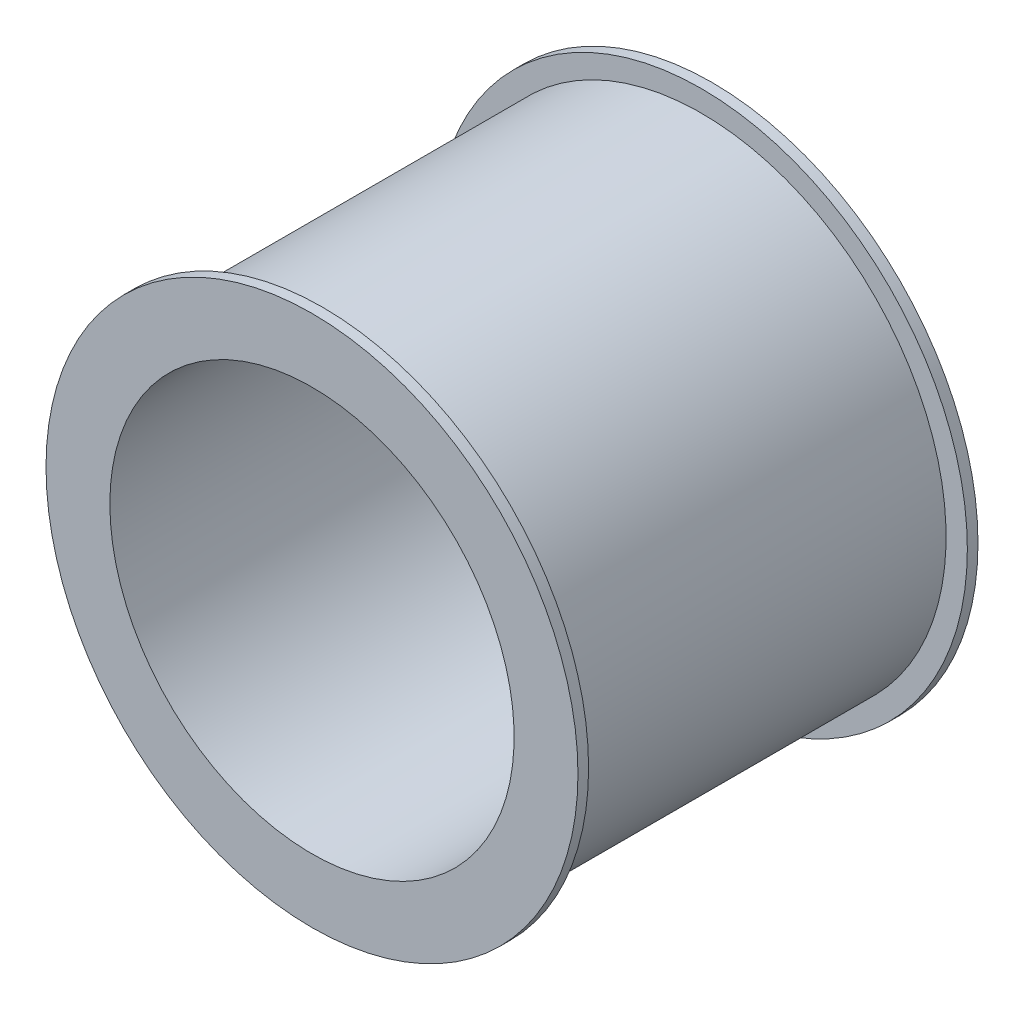
ISO-10303-21;
HEADER;
FILE_DESCRIPTION(('STEP AP214'),'2;1');
FILE_NAME('part.step','',(''),(''),'','','');
FILE_SCHEMA(('AUTOMOTIVE_DESIGN { 1 0 10303 214 1 1 1 1 }'));
ENDSEC;
DATA;
#1=APPLICATION_CONTEXT('core data for automotive mechanical design processes');
#2=APPLICATION_PROTOCOL_DEFINITION('international standard','automotive_design',2000,#1);
#3=PRODUCT_CONTEXT('',#1,'mechanical');
#4=PRODUCT('Part','Part','',(#3));
#5=PRODUCT_RELATED_PRODUCT_CATEGORY('part','',(#4));
#6=PRODUCT_DEFINITION_FORMATION('','',#4);
#7=PRODUCT_DEFINITION_CONTEXT('part definition',#1,'design');
#8=PRODUCT_DEFINITION('design','',#6,#7);
#9=PRODUCT_DEFINITION_SHAPE('','',#8);
#10=(LENGTH_UNIT() NAMED_UNIT(*) SI_UNIT(.MILLI.,.METRE.));
#11=(NAMED_UNIT(*) PLANE_ANGLE_UNIT() SI_UNIT($,.RADIAN.));
#12=(NAMED_UNIT(*) SI_UNIT($,.STERADIAN.) SOLID_ANGLE_UNIT());
#13=UNCERTAINTY_MEASURE_WITH_UNIT(LENGTH_MEASURE(1.E-05),#10,'distance_accuracy_value','');
#14=(GEOMETRIC_REPRESENTATION_CONTEXT(3) GLOBAL_UNCERTAINTY_ASSIGNED_CONTEXT((#13)) GLOBAL_UNIT_ASSIGNED_CONTEXT((#10,
#11,#12)) REPRESENTATION_CONTEXT('',''));
#15=CARTESIAN_POINT('',(0.,0.,0.));
#16=DIRECTION('',(0.,0.,1.));
#17=DIRECTION('',(1.,0.,0.));
#18=AXIS2_PLACEMENT_3D('',#15,#16,#17);
#19=CARTESIAN_POINT('',(0.,0.,18.8));
#20=DIRECTION('',(0.,0.,-1.));
#21=DIRECTION('',(-1.,0.,0.));
#22=AXIS2_PLACEMENT_3D('',#19,#20,#21);
#23=CYLINDRICAL_SURFACE('',#22,11.5);
#24=CARTESIAN_POINT('',(0.,0.,18.3));
#25=DIRECTION('',(0.,0.,1.));
#26=DIRECTION('',(1.,0.,0.));
#27=AXIS2_PLACEMENT_3D('',#24,#25,#26);
#28=CIRCLE('',#27,11.5);
#29=CARTESIAN_POINT('',(-11.5,0.,18.3));
#30=VERTEX_POINT('',#29);
#31=EDGE_CURVE('E60',#30,#30,#28,.T.);
#32=CARTESIAN_POINT('',(0.,0.,0.5));
#33=DIRECTION('',(0.,0.,-1.));
#34=DIRECTION('',(-1.,0.,0.));
#35=AXIS2_PLACEMENT_3D('',#32,#33,#34);
#36=CIRCLE('',#35,11.5);
#37=CARTESIAN_POINT('',(-11.5,0.,0.500000000000004));
#38=VERTEX_POINT('',#37);
#39=EDGE_CURVE('E11',#38,#38,#36,.T.);
#40=CARTESIAN_POINT('',(-11.5,0.,18.3));
#41=CARTESIAN_POINT('',(-11.5,0.,18.1145833333333));
#42=CARTESIAN_POINT('',(-11.5,0.,17.9291666666667));
#43=CARTESIAN_POINT('',(-11.5,0.,17.5583333333333));
#44=CARTESIAN_POINT('',(-11.5,0.,17.3729166666667));
#45=CARTESIAN_POINT('',(-11.5,0.,17.0020833333333));
#46=CARTESIAN_POINT('',(-11.5,0.,16.8166666666667));
#47=CARTESIAN_POINT('',(-11.5,0.,16.4458333333333));
#48=CARTESIAN_POINT('',(-11.5,0.,16.2604166666667));
#49=CARTESIAN_POINT('',(-11.5,0.,15.8895833333333));
#50=CARTESIAN_POINT('',(-11.5,0.,15.7041666666667));
#51=CARTESIAN_POINT('',(-11.5,0.,15.3333333333333));
#52=CARTESIAN_POINT('',(-11.5,0.,15.1479166666667));
#53=CARTESIAN_POINT('',(-11.5,0.,14.7770833333333));
#54=CARTESIAN_POINT('',(-11.5,0.,14.5916666666667));
#55=CARTESIAN_POINT('',(-11.5,0.,14.2208333333333));
#56=CARTESIAN_POINT('',(-11.5,0.,14.0354166666667));
#57=CARTESIAN_POINT('',(-11.5,0.,13.6645833333333));
#58=CARTESIAN_POINT('',(-11.5,0.,13.4791666666667));
#59=CARTESIAN_POINT('',(-11.5,0.,13.1083333333333));
#60=CARTESIAN_POINT('',(-11.5,0.,12.9229166666667));
#61=CARTESIAN_POINT('',(-11.5,0.,12.5520833333333));
#62=CARTESIAN_POINT('',(-11.5,0.,12.3666666666667));
#63=CARTESIAN_POINT('',(-11.5,0.,11.9958333333333));
#64=CARTESIAN_POINT('',(-11.5,0.,11.8104166666667));
#65=CARTESIAN_POINT('',(-11.5,0.,11.4395833333333));
#66=CARTESIAN_POINT('',(-11.5,0.,11.2541666666667));
#67=CARTESIAN_POINT('',(-11.5,0.,10.8833333333333));
#68=CARTESIAN_POINT('',(-11.5,0.,10.6979166666667));
#69=CARTESIAN_POINT('',(-11.5,0.,10.3270833333333));
#70=CARTESIAN_POINT('',(-11.5,0.,10.1416666666667));
#71=CARTESIAN_POINT('',(-11.5,0.,9.77083333333333));
#72=CARTESIAN_POINT('',(-11.5,0.,9.58541666666667));
#73=CARTESIAN_POINT('',(-11.5,0.,9.21458333333333));
#74=CARTESIAN_POINT('',(-11.5,0.,9.02916666666667));
#75=CARTESIAN_POINT('',(-11.5,0.,8.65833333333333));
#76=CARTESIAN_POINT('',(-11.5,0.,8.47291666666667));
#77=CARTESIAN_POINT('',(-11.5,0.,8.10208333333333));
#78=CARTESIAN_POINT('',(-11.5,0.,7.91666666666667));
#79=CARTESIAN_POINT('',(-11.5,0.,7.54583333333333));
#80=CARTESIAN_POINT('',(-11.5,0.,7.36041666666667));
#81=CARTESIAN_POINT('',(-11.5,0.,6.98958333333333));
#82=CARTESIAN_POINT('',(-11.5,0.,6.80416666666667));
#83=CARTESIAN_POINT('',(-11.5,0.,6.43333333333334));
#84=CARTESIAN_POINT('',(-11.5,0.,6.24791666666667));
#85=CARTESIAN_POINT('',(-11.5,0.,5.87708333333334));
#86=CARTESIAN_POINT('',(-11.5,0.,5.69166666666667));
#87=CARTESIAN_POINT('',(-11.5,0.,5.32083333333334));
#88=CARTESIAN_POINT('',(-11.5,0.,5.13541666666667));
#89=CARTESIAN_POINT('',(-11.5,0.,4.76458333333334));
#90=CARTESIAN_POINT('',(-11.5,0.,4.57916666666667));
#91=CARTESIAN_POINT('',(-11.5,0.,4.20833333333334));
#92=CARTESIAN_POINT('',(-11.5,0.,4.02291666666667));
#93=CARTESIAN_POINT('',(-11.5,0.,3.65208333333334));
#94=CARTESIAN_POINT('',(-11.5,0.,3.46666666666667));
#95=CARTESIAN_POINT('',(-11.5,0.,3.09583333333334));
#96=CARTESIAN_POINT('',(-11.5,0.,2.91041666666667));
#97=CARTESIAN_POINT('',(-11.5,0.,2.53958333333334));
#98=CARTESIAN_POINT('',(-11.5,0.,2.35416666666667));
#99=CARTESIAN_POINT('',(-11.5,0.,1.98333333333334));
#100=CARTESIAN_POINT('',(-11.5,0.,1.79791666666667));
#101=CARTESIAN_POINT('',(-11.5,0.,1.42708333333334));
#102=CARTESIAN_POINT('',(-11.5,0.,1.24166666666667));
#103=CARTESIAN_POINT('',(-11.5,0.,0.870833333333338));
#104=CARTESIAN_POINT('',(-11.5,0.,0.685416666666671));
#105=CARTESIAN_POINT('',(-11.5,0.,0.500000000000004));
#106=B_SPLINE_CURVE_WITH_KNOTS('',3,(#40,#41,#42,#43,#44,#45,#46,#47,#48,#49,#50,#51,#52,#53,
#54,#55,#56,#57,#58,#59,#60,#61,#62,#63,#64,#65,#66,#67,#68,#69,#70,#71,#72,#73,#74,#75,#76,#77,
#78,#79,#80,#81,#82,#83,#84,#85,#86,#87,#88,#89,#90,#91,#92,#93,#94,#95,#96,#97,#98,#99,#100,
#101,#102,#103,#104,#105),.UNSPECIFIED.,.F.,.F.,(4,2,2,2,2,2,2,2,2,2,2,2,2,2,2,2,2,2,2,2,2,2,2,
2,2,2,2,2,2,2,2,2,4),(0.,0.556249999999998,1.1125,1.66875,2.225,2.78125,3.3375,3.89375,4.45,
5.00625,5.56249999999999,6.11875,6.67499999999999,7.23124999999999,7.78749999999999,
8.34374999999999,8.89999999999999,9.45624999999999,10.0125,10.56875,11.125,11.68125,12.2375,
12.79375,13.35,13.90625,14.4625,15.01875,15.575,16.13125,16.6875,17.24375,17.8),.UNSPECIFIED.);
#107=EDGE_CURVE('BSEAM57',#30,#38,#106,.T.);
#108=ORIENTED_EDGE('',*,*,#31,.F.);
#109=ORIENTED_EDGE('',*,*,#39,.F.);
#110=ORIENTED_EDGE('',*,*,#107,.T.);
#111=ORIENTED_EDGE('',*,*,#107,.F.);
#112=EDGE_LOOP('',(#108,#110,#109,#111));
#113=FACE_BOUND('',#112,.T.);
#114=ADVANCED_FACE('F57',(#113),#23,.T.);
#115=CARTESIAN_POINT('',(0.,0.,18.8));
#116=DIRECTION('',(0.,0.,1.));
#117=DIRECTION('',(1.,0.,0.));
#118=AXIS2_PLACEMENT_3D('',#115,#116,#117);
#119=PLANE('',#118);
#120=CARTESIAN_POINT('',(0.,0.,18.8));
#121=DIRECTION('',(0.,0.,1.));
#122=DIRECTION('',(1.,0.,0.));
#123=AXIS2_PLACEMENT_3D('',#120,#121,#122);
#124=CIRCLE('',#123,9.5);
#125=CARTESIAN_POINT('',(-9.5,0.,18.8));
#126=VERTEX_POINT('',#125);
#127=EDGE_CURVE('E68',#126,#126,#124,.T.);
#128=ORIENTED_EDGE('',*,*,#127,.F.);
#129=EDGE_LOOP('',(#128));
#130=FACE_BOUND('',#129,.T.);
#131=CARTESIAN_POINT('',(0.,0.,18.8));
#132=DIRECTION('',(0.,0.,1.));
#133=DIRECTION('',(1.,0.,0.));
#134=AXIS2_PLACEMENT_3D('',#131,#132,#133);
#135=CIRCLE('',#134,12.5);
#136=CARTESIAN_POINT('',(12.5,0.,18.8));
#137=VERTEX_POINT('',#136);
#138=EDGE_CURVE('E77',#137,#137,#135,.T.);
#139=ORIENTED_EDGE('',*,*,#138,.T.);
#140=EDGE_LOOP('',(#139));
#141=FACE_BOUND('',#140,.T.);
#142=ADVANCED_FACE('F95',(#130,#141),#119,.T.);
#143=CARTESIAN_POINT('',(0.,0.,0.));
#144=DIRECTION('',(0.,0.,1.));
#145=DIRECTION('',(1.,0.,0.));
#146=AXIS2_PLACEMENT_3D('',#143,#144,#145);
#147=PLANE('',#146);
#148=CARTESIAN_POINT('',(0.,0.,0.));
#149=DIRECTION('',(0.,0.,1.));
#150=DIRECTION('',(1.,0.,0.));
#151=AXIS2_PLACEMENT_3D('',#148,#149,#150);
#152=CIRCLE('',#151,9.5);
#153=CARTESIAN_POINT('',(-9.5,0.,0.));
#154=VERTEX_POINT('',#153);
#155=EDGE_CURVE('E76',#154,#154,#152,.T.);
#156=ORIENTED_EDGE('',*,*,#155,.T.);
#157=EDGE_LOOP('',(#156));
#158=FACE_BOUND('',#157,.T.);
#159=CARTESIAN_POINT('',(0.,0.,0.));
#160=DIRECTION('',(0.,0.,-1.));
#161=DIRECTION('',(-1.,0.,0.));
#162=AXIS2_PLACEMENT_3D('',#159,#160,#161);
#163=CIRCLE('',#162,12.5);
#164=CARTESIAN_POINT('',(-12.5,0.,0.));
#165=VERTEX_POINT('',#164);
#166=EDGE_CURVE('E71',#165,#165,#163,.T.);
#167=ORIENTED_EDGE('',*,*,#166,.T.);
#168=EDGE_LOOP('',(#167));
#169=FACE_BOUND('',#168,.T.);
#170=ADVANCED_FACE('F85',(#158,#169),#147,.F.);
#171=CARTESIAN_POINT('',(0.,0.,18.8));
#172=DIRECTION('',(0.,0.,-1.));
#173=DIRECTION('',(-1.,0.,0.));
#174=AXIS2_PLACEMENT_3D('',#171,#172,#173);
#175=CYLINDRICAL_SURFACE('',#174,9.5);
#176=CARTESIAN_POINT('',(-9.5,0.,0.));
#177=CARTESIAN_POINT('',(-9.5,0.,0.19583333333333));
#178=CARTESIAN_POINT('',(-9.5,0.,0.391666666666664));
#179=CARTESIAN_POINT('',(-9.5,0.,0.78333333333333));
#180=CARTESIAN_POINT('',(-9.5,0.,0.979166666666663));
#181=CARTESIAN_POINT('',(-9.5,0.,1.37083333333333));
#182=CARTESIAN_POINT('',(-9.5,0.,1.56666666666666));
#183=CARTESIAN_POINT('',(-9.5,0.,1.95833333333333));
#184=CARTESIAN_POINT('',(-9.5,0.,2.15416666666666));
#185=CARTESIAN_POINT('',(-9.5,0.,2.54583333333333));
#186=CARTESIAN_POINT('',(-9.5,0.,2.74166666666667));
#187=CARTESIAN_POINT('',(-9.5,0.,3.13333333333333));
#188=CARTESIAN_POINT('',(-9.5,0.,3.32916666666666));
#189=CARTESIAN_POINT('',(-9.5,0.,3.72083333333333));
#190=CARTESIAN_POINT('',(-9.5,0.,3.91666666666666));
#191=CARTESIAN_POINT('',(-9.5,0.,4.30833333333333));
#192=CARTESIAN_POINT('',(-9.5,0.,4.50416666666666));
#193=CARTESIAN_POINT('',(-9.5,0.,4.89583333333333));
#194=CARTESIAN_POINT('',(-9.5,0.,5.09166666666666));
#195=CARTESIAN_POINT('',(-9.5,0.,5.48333333333333));
#196=CARTESIAN_POINT('',(-9.5,0.,5.67916666666666));
#197=CARTESIAN_POINT('',(-9.5,0.,6.07083333333333));
#198=CARTESIAN_POINT('',(-9.5,0.,6.26666666666666));
#199=CARTESIAN_POINT('',(-9.5,0.,6.65833333333333));
#200=CARTESIAN_POINT('',(-9.5,0.,6.85416666666666));
#201=CARTESIAN_POINT('',(-9.5,0.,7.24583333333333));
#202=CARTESIAN_POINT('',(-9.5,0.,7.44166666666666));
#203=CARTESIAN_POINT('',(-9.5,0.,7.83333333333333));
#204=CARTESIAN_POINT('',(-9.5,0.,8.02916666666666));
#205=CARTESIAN_POINT('',(-9.5,0.,8.42083333333333));
#206=CARTESIAN_POINT('',(-9.5,0.,8.61666666666666));
#207=CARTESIAN_POINT('',(-9.5,0.,9.00833333333333));
#208=CARTESIAN_POINT('',(-9.5,0.,9.20416666666666));
#209=CARTESIAN_POINT('',(-9.5,0.,9.59583333333333));
#210=CARTESIAN_POINT('',(-9.5,0.,9.79166666666666));
#211=CARTESIAN_POINT('',(-9.5,0.,10.1833333333333));
#212=CARTESIAN_POINT('',(-9.5,0.,10.3791666666667));
#213=CARTESIAN_POINT('',(-9.5,0.,10.7708333333333));
#214=CARTESIAN_POINT('',(-9.5,0.,10.9666666666667));
#215=CARTESIAN_POINT('',(-9.5,0.,11.3583333333333));
#216=CARTESIAN_POINT('',(-9.5,0.,11.5541666666667));
#217=CARTESIAN_POINT('',(-9.5,0.,11.9458333333333));
#218=CARTESIAN_POINT('',(-9.5,0.,12.1416666666667));
#219=CARTESIAN_POINT('',(-9.5,0.,12.5333333333333));
#220=CARTESIAN_POINT('',(-9.5,0.,12.7291666666667));
#221=CARTESIAN_POINT('',(-9.5,0.,13.1208333333333));
#222=CARTESIAN_POINT('',(-9.5,0.,13.3166666666667));
#223=CARTESIAN_POINT('',(-9.5,0.,13.7083333333333));
#224=CARTESIAN_POINT('',(-9.5,0.,13.9041666666667));
#225=CARTESIAN_POINT('',(-9.5,0.,14.2958333333333));
#226=CARTESIAN_POINT('',(-9.5,0.,14.4916666666667));
#227=CARTESIAN_POINT('',(-9.5,0.,14.8833333333333));
#228=CARTESIAN_POINT('',(-9.5,0.,15.0791666666667));
#229=CARTESIAN_POINT('',(-9.5,0.,15.4708333333333));
#230=CARTESIAN_POINT('',(-9.5,0.,15.6666666666667));
#231=CARTESIAN_POINT('',(-9.5,0.,16.0583333333333));
#232=CARTESIAN_POINT('',(-9.5,0.,16.2541666666667));
#233=CARTESIAN_POINT('',(-9.5,0.,16.6458333333333));
#234=CARTESIAN_POINT('',(-9.5,0.,16.8416666666667));
#235=CARTESIAN_POINT('',(-9.5,0.,17.2333333333333));
#236=CARTESIAN_POINT('',(-9.5,0.,17.4291666666667));
#237=CARTESIAN_POINT('',(-9.5,0.,17.8208333333333));
#238=CARTESIAN_POINT('',(-9.5,0.,18.0166666666667));
#239=CARTESIAN_POINT('',(-9.5,0.,18.4083333333333));
#240=CARTESIAN_POINT('',(-9.5,0.,18.6041666666667));
#241=CARTESIAN_POINT('',(-9.5,0.,18.8));
#242=B_SPLINE_CURVE_WITH_KNOTS('',3,(#176,#177,#178,#179,#180,#181,#182,#183,#184,#185,#186,
#187,#188,#189,#190,#191,#192,#193,#194,#195,#196,#197,#198,#199,#200,#201,#202,#203,#204,#205,
#206,#207,#208,#209,#210,#211,#212,#213,#214,#215,#216,#217,#218,#219,#220,#221,#222,#223,#224,
#225,#226,#227,#228,#229,#230,#231,#232,#233,#234,#235,#236,#237,#238,#239,#240,#241),
.UNSPECIFIED.,.F.,.F.,(4,2,2,2,2,2,2,2,2,2,2,2,2,2,2,2,2,2,2,2,2,2,2,2,2,2,2,2,2,2,2,2,4),(0.,
0.587500000000001,1.175,1.7625,2.35,2.9375,3.525,4.1125,4.7,5.2875,5.875,6.4625,7.05,7.6375,
8.225,8.8125,9.4,9.9875,10.575,11.1625,11.75,12.3375,12.925,13.5125,14.1,14.6875,15.275,15.8625,
16.45,17.0375,17.625,18.2125,18.8),.UNSPECIFIED.);
#243=EDGE_CURVE('BSEAM88',#154,#126,#242,.T.);
#244=ORIENTED_EDGE('',*,*,#155,.F.);
#245=ORIENTED_EDGE('',*,*,#127,.T.);
#246=ORIENTED_EDGE('',*,*,#243,.T.);
#247=ORIENTED_EDGE('',*,*,#243,.F.);
#248=EDGE_LOOP('',(#244,#246,#245,#247));
#249=FACE_BOUND('',#248,.T.);
#250=ADVANCED_FACE('F88',(#249),#175,.F.);
#251=CARTESIAN_POINT('',(0.,0.,18.3));
#252=DIRECTION('',(0.,0.,1.));
#253=DIRECTION('',(1.,0.,0.));
#254=AXIS2_PLACEMENT_3D('',#251,#252,#253);
#255=CYLINDRICAL_SURFACE('',#254,12.5);
#256=CARTESIAN_POINT('',(0.,0.,18.3));
#257=DIRECTION('',(0.,0.,1.));
#258=DIRECTION('',(1.,0.,0.));
#259=AXIS2_PLACEMENT_3D('',#256,#257,#258);
#260=CIRCLE('',#259,12.5);
#261=CARTESIAN_POINT('',(12.5,0.,18.3));
#262=VERTEX_POINT('',#261);
#263=EDGE_CURVE('E73',#262,#262,#260,.T.);
#264=ORIENTED_EDGE('',*,*,#263,.T.);
#265=EDGE_LOOP('',(#264));
#266=FACE_BOUND('',#265,.T.);
#267=ORIENTED_EDGE('',*,*,#138,.F.);
#268=EDGE_LOOP('',(#267));
#269=FACE_BOUND('',#268,.T.);
#270=ADVANCED_FACE('F91',(#266,#269),#255,.T.);
#271=CARTESIAN_POINT('',(0.,0.,18.3));
#272=DIRECTION('',(0.,0.,1.));
#273=DIRECTION('',(1.,0.,0.));
#274=AXIS2_PLACEMENT_3D('',#271,#272,#273);
#275=PLANE('',#274);
#276=ORIENTED_EDGE('',*,*,#31,.T.);
#277=EDGE_LOOP('',(#276));
#278=FACE_BOUND('',#277,.T.);
#279=ORIENTED_EDGE('',*,*,#263,.F.);
#280=EDGE_LOOP('',(#279));
#281=FACE_BOUND('',#280,.T.);
#282=ADVANCED_FACE('F102',(#278,#281),#275,.F.);
#283=CARTESIAN_POINT('',(0.,0.,0.5));
#284=DIRECTION('',(0.,0.,-1.));
#285=DIRECTION('',(-1.,0.,0.));
#286=AXIS2_PLACEMENT_3D('',#283,#284,#285);
#287=PLANE('',#286);
#288=CARTESIAN_POINT('',(0.,0.,0.5));
#289=DIRECTION('',(0.,0.,-1.));
#290=DIRECTION('',(-1.,0.,0.));
#291=AXIS2_PLACEMENT_3D('',#288,#289,#290);
#292=CIRCLE('',#291,12.5);
#293=CARTESIAN_POINT('',(-12.5,0.,0.5));
#294=VERTEX_POINT('',#293);
#295=EDGE_CURVE('E80',#294,#294,#292,.T.);
#296=ORIENTED_EDGE('',*,*,#295,.F.);
#297=EDGE_LOOP('',(#296));
#298=FACE_BOUND('',#297,.T.);
#299=ORIENTED_EDGE('',*,*,#39,.T.);
#300=EDGE_LOOP('',(#299));
#301=FACE_BOUND('',#300,.T.);
#302=ADVANCED_FACE('F108',(#298,#301),#287,.F.);
#303=CARTESIAN_POINT('',(0.,0.,0.5));
#304=DIRECTION('',(0.,0.,-1.));
#305=DIRECTION('',(-1.,0.,0.));
#306=AXIS2_PLACEMENT_3D('',#303,#304,#305);
#307=CYLINDRICAL_SURFACE('',#306,12.5);
#308=ORIENTED_EDGE('',*,*,#295,.T.);
#309=EDGE_LOOP('',(#308));
#310=FACE_BOUND('',#309,.T.);
#311=ORIENTED_EDGE('',*,*,#166,.F.);
#312=EDGE_LOOP('',(#311));
#313=FACE_BOUND('',#312,.T.);
#314=ADVANCED_FACE('F143',(#310,#313),#307,.T.);
#315=CLOSED_SHELL('',(#114,#142,#170,#250,#270,#282,#302,#314));
#316=MANIFOLD_SOLID_BREP('B2',#315);
#317=ADVANCED_BREP_SHAPE_REPRESENTATION('',(#18,#316),#14);
#318=SHAPE_DEFINITION_REPRESENTATION(#9,#317);
ENDSEC;
END-ISO-10303-21;
